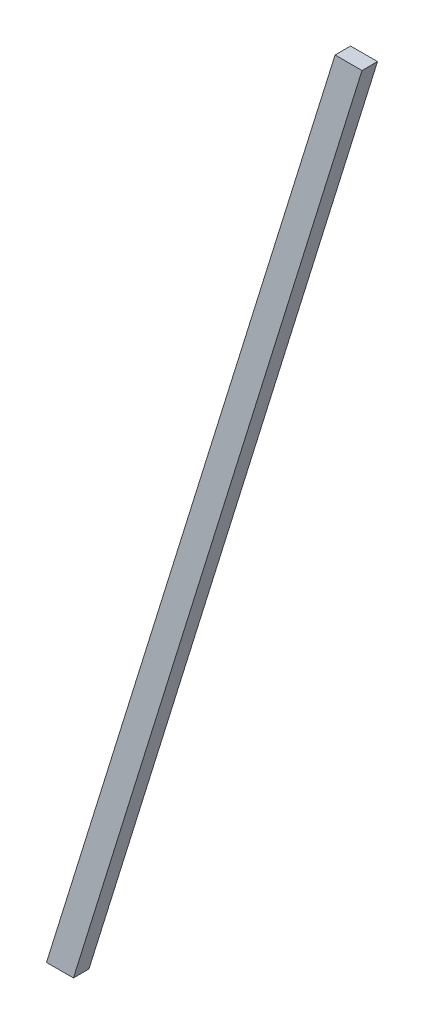
ISO-10303-21;
HEADER;
FILE_DESCRIPTION(('STEP AP214'),'2;1');
FILE_NAME('part.step','',(''),(''),'','','');
FILE_SCHEMA(('AUTOMOTIVE_DESIGN { 1 0 10303 214 1 1 1 1 }'));
ENDSEC;
DATA;
#1=APPLICATION_CONTEXT('core data for automotive mechanical design processes');
#2=APPLICATION_PROTOCOL_DEFINITION('international standard','automotive_design',2000,#1);
#3=PRODUCT_CONTEXT('',#1,'mechanical');
#4=PRODUCT('Part','Part','',(#3));
#5=PRODUCT_RELATED_PRODUCT_CATEGORY('part','',(#4));
#6=PRODUCT_DEFINITION_FORMATION('','',#4);
#7=PRODUCT_DEFINITION_CONTEXT('part definition',#1,'design');
#8=PRODUCT_DEFINITION('design','',#6,#7);
#9=PRODUCT_DEFINITION_SHAPE('','',#8);
#10=(LENGTH_UNIT() NAMED_UNIT(*) SI_UNIT(.MILLI.,.METRE.));
#11=(NAMED_UNIT(*) PLANE_ANGLE_UNIT() SI_UNIT($,.RADIAN.));
#12=(NAMED_UNIT(*) SI_UNIT($,.STERADIAN.) SOLID_ANGLE_UNIT());
#13=UNCERTAINTY_MEASURE_WITH_UNIT(LENGTH_MEASURE(1.E-05),#10,'distance_accuracy_value','');
#14=(GEOMETRIC_REPRESENTATION_CONTEXT(3) GLOBAL_UNCERTAINTY_ASSIGNED_CONTEXT((#13)) GLOBAL_UNIT_ASSIGNED_CONTEXT((#10,
#11,#12)) REPRESENTATION_CONTEXT('',''));
#15=CARTESIAN_POINT('',(0.,0.,0.));
#16=DIRECTION('',(0.,0.,1.));
#17=DIRECTION('',(1.,0.,0.));
#18=AXIS2_PLACEMENT_3D('',#15,#16,#17);
#19=CARTESIAN_POINT('',(-180.4741897084,-51.5344273879484,10.));
#20=DIRECTION('',(0.955089010896737,-0.296319053157729,0.));
#21=DIRECTION('',(0.296319053157729,0.955089010896737,0.));
#22=AXIS2_PLACEMENT_3D('',#19,#20,#21);
#23=PLANE('',#22);
#24=DIRECTION('',(-0.296319053157729,-0.955089010896737,0.));
#25=VECTOR('',#24,1.);
#26=CARTESIAN_POINT('',(-180.4741897084,-51.5344273879484,0.));
#27=LINE('',#26,#25);
#28=CARTESIAN_POINT('',(5.67749863288749,548.465572612052,0.));
#29=VERTEX_POINT('',#28);
#30=CARTESIAN_POINT('',(-180.4741897084,-51.5344273879484,0.));
#31=VERTEX_POINT('',#30);
#32=EDGE_CURVE('E113',#29,#31,#27,.T.);
#33=ORIENTED_EDGE('',*,*,#32,.T.);
#34=DIRECTION('',(0.,0.,-1.));
#35=VECTOR('',#34,1.);
#36=CARTESIAN_POINT('',(-180.4741897084,-51.5344273879484,10.));
#37=LINE('',#36,#35);
#38=CARTESIAN_POINT('',(-180.4741897084,-51.5344273879484,10.));
#39=VERTEX_POINT('',#38);
#40=EDGE_CURVE('E11',#39,#31,#37,.T.);
#41=ORIENTED_EDGE('',*,*,#40,.F.);
#42=DIRECTION('',(-0.296319053157729,-0.955089010896737,0.));
#43=VECTOR('',#42,1.);
#44=CARTESIAN_POINT('',(-180.4741897084,-51.5344273879484,10.));
#45=LINE('',#44,#43);
#46=CARTESIAN_POINT('',(5.67749863288749,548.465572612052,10.));
#47=VERTEX_POINT('',#46);
#48=EDGE_CURVE('E97',#47,#39,#45,.T.);
#49=ORIENTED_EDGE('',*,*,#48,.F.);
#50=DIRECTION('',(0.,0.,-1.));
#51=VECTOR('',#50,1.);
#52=CARTESIAN_POINT('',(5.67749863288749,548.465572612052,10.));
#53=LINE('',#52,#51);
#54=EDGE_CURVE('E109',#47,#29,#53,.T.);
#55=ORIENTED_EDGE('',*,*,#54,.T.);
#56=EDGE_LOOP('',(#33,#41,#49,#55));
#57=FACE_BOUND('',#56,.T.);
#58=ADVANCED_FACE('F45',(#57),#23,.F.);
#59=CARTESIAN_POINT('',(-163.090936890364,-51.5344273879484,10.));
#60=DIRECTION('',(0.,1.,0.));
#61=DIRECTION('',(0.,0.,1.));
#62=AXIS2_PLACEMENT_3D('',#59,#60,#61);
#63=PLANE('',#62);
#64=DIRECTION('',(1.,0.,0.));
#65=VECTOR('',#64,1.);
#66=CARTESIAN_POINT('',(-163.090936890364,-51.5344273879484,0.));
#67=LINE('',#66,#65);
#68=CARTESIAN_POINT('',(-163.090936890364,-51.5344273879484,0.));
#69=VERTEX_POINT('',#68);
#70=EDGE_CURVE('E102',#31,#69,#67,.T.);
#71=ORIENTED_EDGE('',*,*,#70,.T.);
#72=DIRECTION('',(0.,0.,-1.));
#73=VECTOR('',#72,1.);
#74=CARTESIAN_POINT('',(-163.090936890364,-51.5344273879484,10.));
#75=LINE('',#74,#73);
#76=CARTESIAN_POINT('',(-163.090936890364,-51.5344273879484,10.));
#77=VERTEX_POINT('',#76);
#78=EDGE_CURVE('E54',#77,#69,#75,.T.);
#79=ORIENTED_EDGE('',*,*,#78,.F.);
#80=DIRECTION('',(1.,0.,0.));
#81=VECTOR('',#80,1.);
#82=CARTESIAN_POINT('',(-163.090936890364,-51.5344273879484,10.));
#83=LINE('',#82,#81);
#84=EDGE_CURVE('E92',#39,#77,#83,.T.);
#85=ORIENTED_EDGE('',*,*,#84,.F.);
#86=ORIENTED_EDGE('',*,*,#40,.T.);
#87=EDGE_LOOP('',(#71,#79,#85,#86));
#88=FACE_BOUND('',#87,.T.);
#89=ADVANCED_FACE('F101',(#88),#63,.F.);
#90=CARTESIAN_POINT('',(23.0607514509229,548.465572612052,10.));
#91=DIRECTION('',(-0.955089010896737,0.296319053157729,0.));
#92=DIRECTION('',(-0.296319053157729,-0.955089010896737,0.));
#93=AXIS2_PLACEMENT_3D('',#90,#91,#92);
#94=PLANE('',#93);
#95=DIRECTION('',(0.296319053157729,0.955089010896737,0.));
#96=VECTOR('',#95,1.);
#97=CARTESIAN_POINT('',(23.0607514509229,548.465572612052,0.));
#98=LINE('',#97,#96);
#99=CARTESIAN_POINT('',(23.0607514509229,548.465572612052,0.));
#100=VERTEX_POINT('',#99);
#101=EDGE_CURVE('E79',#69,#100,#98,.T.);
#102=ORIENTED_EDGE('',*,*,#101,.T.);
#103=DIRECTION('',(0.,0.,-1.));
#104=VECTOR('',#103,1.);
#105=CARTESIAN_POINT('',(23.0607514509229,548.465572612052,10.));
#106=LINE('',#105,#104);
#107=CARTESIAN_POINT('',(23.0607514509229,548.465572612052,10.));
#108=VERTEX_POINT('',#107);
#109=EDGE_CURVE('E104',#108,#100,#106,.T.);
#110=ORIENTED_EDGE('',*,*,#109,.F.);
#111=DIRECTION('',(0.296319053157729,0.955089010896737,0.));
#112=VECTOR('',#111,1.);
#113=CARTESIAN_POINT('',(23.0607514509229,548.465572612052,10.));
#114=LINE('',#113,#112);
#115=EDGE_CURVE('E95',#77,#108,#114,.T.);
#116=ORIENTED_EDGE('',*,*,#115,.F.);
#117=ORIENTED_EDGE('',*,*,#78,.T.);
#118=EDGE_LOOP('',(#102,#110,#116,#117));
#119=FACE_BOUND('',#118,.T.);
#120=ADVANCED_FACE('F105',(#119),#94,.F.);
#121=CARTESIAN_POINT('',(5.67749863288749,548.465572612052,10.));
#122=DIRECTION('',(0.,-1.,0.));
#123=DIRECTION('',(1.,0.,0.));
#124=AXIS2_PLACEMENT_3D('',#121,#122,#123);
#125=PLANE('',#124);
#126=DIRECTION('',(-1.,0.,0.));
#127=VECTOR('',#126,1.);
#128=CARTESIAN_POINT('',(5.67749863288749,548.465572612052,0.));
#129=LINE('',#128,#127);
#130=EDGE_CURVE('E85',#100,#29,#129,.T.);
#131=ORIENTED_EDGE('',*,*,#130,.T.);
#132=ORIENTED_EDGE('',*,*,#54,.F.);
#133=DIRECTION('',(-1.,0.,0.));
#134=VECTOR('',#133,1.);
#135=CARTESIAN_POINT('',(5.67749863288749,548.465572612052,10.));
#136=LINE('',#135,#134);
#137=EDGE_CURVE('E62',#108,#47,#136,.T.);
#138=ORIENTED_EDGE('',*,*,#137,.F.);
#139=ORIENTED_EDGE('',*,*,#109,.T.);
#140=EDGE_LOOP('',(#131,#132,#138,#139));
#141=FACE_BOUND('',#140,.T.);
#142=ADVANCED_FACE('F126',(#141),#125,.F.);
#143=CARTESIAN_POINT('',(0.,0.,10.));
#144=DIRECTION('',(0.,0.,-1.));
#145=DIRECTION('',(-1.,0.,0.));
#146=AXIS2_PLACEMENT_3D('',#143,#144,#145);
#147=PLANE('',#146);
#148=ORIENTED_EDGE('',*,*,#48,.T.);
#149=ORIENTED_EDGE('',*,*,#84,.T.);
#150=ORIENTED_EDGE('',*,*,#115,.T.);
#151=ORIENTED_EDGE('',*,*,#137,.T.);
#152=EDGE_LOOP('',(#148,#149,#150,#151));
#153=FACE_BOUND('',#152,.T.);
#154=ADVANCED_FACE('F93',(#153),#147,.F.);
#155=CARTESIAN_POINT('',(0.,0.,0.));
#156=DIRECTION('',(0.,0.,-1.));
#157=DIRECTION('',(-1.,0.,0.));
#158=AXIS2_PLACEMENT_3D('',#155,#156,#157);
#159=PLANE('',#158);
#160=ORIENTED_EDGE('',*,*,#32,.F.);
#161=ORIENTED_EDGE('',*,*,#130,.F.);
#162=ORIENTED_EDGE('',*,*,#101,.F.);
#163=ORIENTED_EDGE('',*,*,#70,.F.);
#164=EDGE_LOOP('',(#160,#161,#162,#163));
#165=FACE_BOUND('',#164,.T.);
#166=ADVANCED_FACE('F129',(#165),#159,.T.);
#167=CLOSED_SHELL('',(#58,#89,#120,#142,#154,#166));
#168=MANIFOLD_SOLID_BREP('B2',#167);
#169=ADVANCED_BREP_SHAPE_REPRESENTATION('',(#18,#168),#14);
#170=SHAPE_DEFINITION_REPRESENTATION(#9,#169);
ENDSEC;
END-ISO-10303-21;
